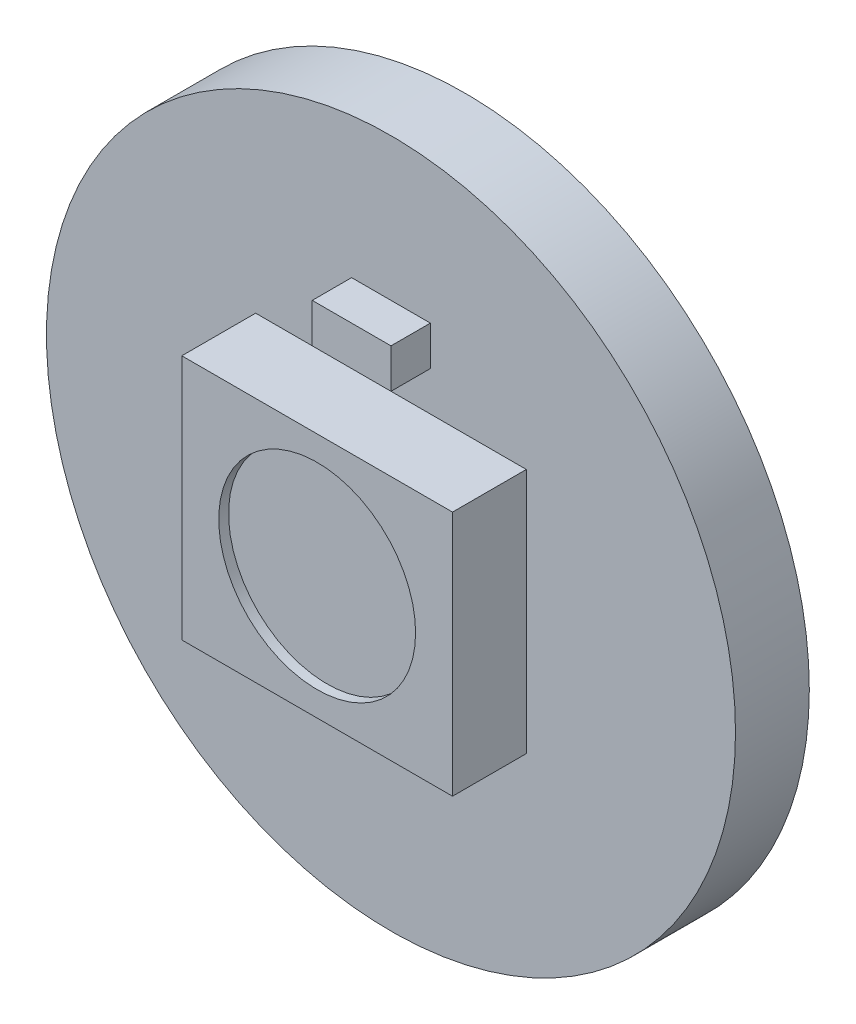
ISO-10303-21;
HEADER;
FILE_DESCRIPTION(('STEP AP214'),'2;1');
FILE_NAME('part.step','',(''),(''),'','','');
FILE_SCHEMA(('AUTOMOTIVE_DESIGN { 1 0 10303 214 1 1 1 1 }'));
ENDSEC;
DATA;
#1=APPLICATION_CONTEXT('core data for automotive mechanical design processes');
#2=APPLICATION_PROTOCOL_DEFINITION('international standard','automotive_design',2000,#1);
#3=PRODUCT_CONTEXT('',#1,'mechanical');
#4=PRODUCT('Part','Part','',(#3));
#5=PRODUCT_RELATED_PRODUCT_CATEGORY('part','',(#4));
#6=PRODUCT_DEFINITION_FORMATION('','',#4);
#7=PRODUCT_DEFINITION_CONTEXT('part definition',#1,'design');
#8=PRODUCT_DEFINITION('design','',#6,#7);
#9=PRODUCT_DEFINITION_SHAPE('','',#8);
#10=(LENGTH_UNIT() NAMED_UNIT(*) SI_UNIT(.MILLI.,.METRE.));
#11=(NAMED_UNIT(*) PLANE_ANGLE_UNIT() SI_UNIT($,.RADIAN.));
#12=(NAMED_UNIT(*) SI_UNIT($,.STERADIAN.) SOLID_ANGLE_UNIT());
#13=UNCERTAINTY_MEASURE_WITH_UNIT(LENGTH_MEASURE(1.E-05),#10,'distance_accuracy_value','');
#14=(GEOMETRIC_REPRESENTATION_CONTEXT(3) GLOBAL_UNCERTAINTY_ASSIGNED_CONTEXT((#13)) GLOBAL_UNIT_ASSIGNED_CONTEXT((#10,
#11,#12)) REPRESENTATION_CONTEXT('',''));
#15=CARTESIAN_POINT('',(0.,0.,0.));
#16=DIRECTION('',(0.,0.,1.));
#17=DIRECTION('',(1.,0.,0.));
#18=AXIS2_PLACEMENT_3D('',#15,#16,#17);
#19=CARTESIAN_POINT('',(0.,0.,1.5));
#20=DIRECTION('',(0.,0.,1.));
#21=DIRECTION('',(1.,0.,0.));
#22=AXIS2_PLACEMENT_3D('',#19,#20,#21);
#23=PLANE('',#22);
#24=DIRECTION('',(0.,1.,0.));
#25=VECTOR('',#24,1.);
#26=CARTESIAN_POINT('',(2.75,2.5,1.5));
#27=LINE('',#26,#25);
#28=CARTESIAN_POINT('',(2.75,-2.5,1.5));
#29=VERTEX_POINT('',#28);
#30=CARTESIAN_POINT('',(2.75,2.5,1.5));
#31=VERTEX_POINT('',#30);
#32=EDGE_CURVE('E55',#29,#31,#27,.T.);
#33=ORIENTED_EDGE('',*,*,#32,.F.);
#34=DIRECTION('',(1.,0.,0.));
#35=VECTOR('',#34,1.);
#36=CARTESIAN_POINT('',(-2.75,-2.5,1.5));
#37=LINE('',#36,#35);
#38=CARTESIAN_POINT('',(-2.75,-2.5,1.5));
#39=VERTEX_POINT('',#38);
#40=EDGE_CURVE('E136',#39,#29,#37,.T.);
#41=ORIENTED_EDGE('',*,*,#40,.F.);
#42=DIRECTION('',(0.,-1.,0.));
#43=VECTOR('',#42,1.);
#44=CARTESIAN_POINT('',(-2.75,2.5,1.5));
#45=LINE('',#44,#43);
#46=CARTESIAN_POINT('',(-2.75,2.5,1.5));
#47=VERTEX_POINT('',#46);
#48=EDGE_CURVE('E147',#47,#39,#45,.T.);
#49=ORIENTED_EDGE('',*,*,#48,.F.);
#50=DIRECTION('',(-1.,0.,0.));
#51=VECTOR('',#50,1.);
#52=CARTESIAN_POINT('',(-2.75,2.5,1.5));
#53=LINE('',#52,#51);
#54=EDGE_CURVE('E144',#31,#47,#53,.T.);
#55=ORIENTED_EDGE('',*,*,#54,.F.);
#56=EDGE_LOOP('',(#33,#41,#49,#55));
#57=FACE_BOUND('',#56,.T.);
#58=CARTESIAN_POINT('',(0.,0.,1.5));
#59=DIRECTION('',(0.,0.,1.));
#60=DIRECTION('',(1.,0.,0.));
#61=AXIS2_PLACEMENT_3D('',#58,#59,#60);
#62=CIRCLE('',#61,7.);
#63=CARTESIAN_POINT('',(7.,0.,1.5));
#64=VERTEX_POINT('',#63);
#65=EDGE_CURVE('E11',#64,#64,#62,.T.);
#66=ORIENTED_EDGE('',*,*,#65,.T.);
#67=EDGE_LOOP('',(#66));
#68=FACE_BOUND('',#67,.T.);
#69=DIRECTION('',(-1.,0.,0.));
#70=VECTOR('',#69,1.);
#71=CARTESIAN_POINT('',(-0.8,4.1,1.5));
#72=LINE('',#71,#70);
#73=CARTESIAN_POINT('',(0.8,4.1,1.5));
#74=VERTEX_POINT('',#73);
#75=CARTESIAN_POINT('',(-0.8,4.1,1.5));
#76=VERTEX_POINT('',#75);
#77=EDGE_CURVE('E311',#74,#76,#72,.T.);
#78=ORIENTED_EDGE('',*,*,#77,.F.);
#79=DIRECTION('',(0.,1.,0.));
#80=VECTOR('',#79,1.);
#81=CARTESIAN_POINT('',(0.8,4.1,1.5));
#82=LINE('',#81,#80);
#83=CARTESIAN_POINT('',(0.8,3.3,1.5));
#84=VERTEX_POINT('',#83);
#85=EDGE_CURVE('E120',#84,#74,#82,.T.);
#86=ORIENTED_EDGE('',*,*,#85,.F.);
#87=DIRECTION('',(1.,0.,0.));
#88=VECTOR('',#87,1.);
#89=CARTESIAN_POINT('',(-0.8,3.3,1.5));
#90=LINE('',#89,#88);
#91=CARTESIAN_POINT('',(-0.8,3.3,1.5));
#92=VERTEX_POINT('',#91);
#93=EDGE_CURVE('E116',#92,#84,#90,.T.);
#94=ORIENTED_EDGE('',*,*,#93,.F.);
#95=DIRECTION('',(0.,-1.,0.));
#96=VECTOR('',#95,1.);
#97=CARTESIAN_POINT('',(-0.8,4.1,1.5));
#98=LINE('',#97,#96);
#99=EDGE_CURVE('E308',#76,#92,#98,.T.);
#100=ORIENTED_EDGE('',*,*,#99,.F.);
#101=EDGE_LOOP('',(#78,#86,#94,#100));
#102=FACE_BOUND('',#101,.T.);
#103=ADVANCED_FACE('F32',(#57,#68,#102),#23,.T.);
#104=CARTESIAN_POINT('',(0.,0.,1.5));
#105=DIRECTION('',(0.,0.,-1.));
#106=DIRECTION('',(-1.,0.,0.));
#107=AXIS2_PLACEMENT_3D('',#104,#105,#106);
#108=CYLINDRICAL_SURFACE('',#107,7.);
#109=ORIENTED_EDGE('',*,*,#65,.F.);
#110=EDGE_LOOP('',(#109));
#111=FACE_BOUND('',#110,.T.);
#112=CARTESIAN_POINT('',(0.,0.,0.));
#113=DIRECTION('',(0.,0.,1.));
#114=DIRECTION('',(1.,0.,0.));
#115=AXIS2_PLACEMENT_3D('',#112,#113,#114);
#116=CIRCLE('',#115,7.);
#117=CARTESIAN_POINT('',(7.,0.,0.));
#118=VERTEX_POINT('',#117);
#119=EDGE_CURVE('E36',#118,#118,#116,.T.);
#120=ORIENTED_EDGE('',*,*,#119,.T.);
#121=EDGE_LOOP('',(#120));
#122=FACE_BOUND('',#121,.T.);
#123=ADVANCED_FACE('F34',(#111,#122),#108,.T.);
#124=CARTESIAN_POINT('',(0.,0.,0.));
#125=DIRECTION('',(0.,0.,1.));
#126=DIRECTION('',(1.,0.,0.));
#127=AXIS2_PLACEMENT_3D('',#124,#125,#126);
#128=PLANE('',#127);
#129=ORIENTED_EDGE('',*,*,#119,.F.);
#130=EDGE_LOOP('',(#129));
#131=FACE_BOUND('',#130,.T.);
#132=ADVANCED_FACE('F167',(#131),#128,.F.);
#133=CARTESIAN_POINT('',(2.75,2.5,3.));
#134=DIRECTION('',(-1.,0.,0.));
#135=DIRECTION('',(0.,-1.,0.));
#136=AXIS2_PLACEMENT_3D('',#133,#134,#135);
#137=PLANE('',#136);
#138=ORIENTED_EDGE('',*,*,#32,.T.);
#139=DIRECTION('',(0.,0.,-1.));
#140=VECTOR('',#139,1.);
#141=CARTESIAN_POINT('',(2.75,2.5,3.));
#142=LINE('',#141,#140);
#143=CARTESIAN_POINT('',(2.75,2.5,3.));
#144=VERTEX_POINT('',#143);
#145=EDGE_CURVE('E159',#144,#31,#142,.T.);
#146=ORIENTED_EDGE('',*,*,#145,.F.);
#147=DIRECTION('',(0.,1.,0.));
#148=VECTOR('',#147,1.);
#149=CARTESIAN_POINT('',(2.75,2.5,3.));
#150=LINE('',#149,#148);
#151=CARTESIAN_POINT('',(2.75,-2.5,3.));
#152=VERTEX_POINT('',#151);
#153=EDGE_CURVE('E132',#152,#144,#150,.T.);
#154=ORIENTED_EDGE('',*,*,#153,.F.);
#155=DIRECTION('',(0.,0.,-1.));
#156=VECTOR('',#155,1.);
#157=CARTESIAN_POINT('',(2.75,-2.5,3.));
#158=LINE('',#157,#156);
#159=EDGE_CURVE('E142',#152,#29,#158,.T.);
#160=ORIENTED_EDGE('',*,*,#159,.T.);
#161=EDGE_LOOP('',(#138,#146,#154,#160));
#162=FACE_BOUND('',#161,.T.);
#163=ADVANCED_FACE('F169',(#162),#137,.F.);
#164=CARTESIAN_POINT('',(-2.75,2.5,3.));
#165=DIRECTION('',(0.,-1.,0.));
#166=DIRECTION('',(0.,0.,-1.));
#167=AXIS2_PLACEMENT_3D('',#164,#165,#166);
#168=PLANE('',#167);
#169=ORIENTED_EDGE('',*,*,#54,.T.);
#170=DIRECTION('',(0.,0.,-1.));
#171=VECTOR('',#170,1.);
#172=CARTESIAN_POINT('',(-2.75,2.5,3.));
#173=LINE('',#172,#171);
#174=CARTESIAN_POINT('',(-2.75,2.5,3.));
#175=VERTEX_POINT('',#174);
#176=EDGE_CURVE('E156',#175,#47,#173,.T.);
#177=ORIENTED_EDGE('',*,*,#176,.F.);
#178=DIRECTION('',(-1.,0.,0.));
#179=VECTOR('',#178,1.);
#180=CARTESIAN_POINT('',(-2.75,2.5,3.));
#181=LINE('',#180,#179);
#182=EDGE_CURVE('E135',#144,#175,#181,.T.);
#183=ORIENTED_EDGE('',*,*,#182,.F.);
#184=ORIENTED_EDGE('',*,*,#145,.T.);
#185=EDGE_LOOP('',(#169,#177,#183,#184));
#186=FACE_BOUND('',#185,.T.);
#187=ADVANCED_FACE('F174',(#186),#168,.F.);
#188=CARTESIAN_POINT('',(-2.75,2.5,3.));
#189=DIRECTION('',(1.,0.,0.));
#190=DIRECTION('',(0.,1.,0.));
#191=AXIS2_PLACEMENT_3D('',#188,#189,#190);
#192=PLANE('',#191);
#193=ORIENTED_EDGE('',*,*,#48,.T.);
#194=DIRECTION('',(0.,0.,-1.));
#195=VECTOR('',#194,1.);
#196=CARTESIAN_POINT('',(-2.75,-2.5,3.));
#197=LINE('',#196,#195);
#198=CARTESIAN_POINT('',(-2.75,-2.5,3.));
#199=VERTEX_POINT('',#198);
#200=EDGE_CURVE('E153',#199,#39,#197,.T.);
#201=ORIENTED_EDGE('',*,*,#200,.F.);
#202=DIRECTION('',(0.,-1.,0.));
#203=VECTOR('',#202,1.);
#204=CARTESIAN_POINT('',(-2.75,2.5,3.));
#205=LINE('',#204,#203);
#206=EDGE_CURVE('E138',#175,#199,#205,.T.);
#207=ORIENTED_EDGE('',*,*,#206,.F.);
#208=ORIENTED_EDGE('',*,*,#176,.T.);
#209=EDGE_LOOP('',(#193,#201,#207,#208));
#210=FACE_BOUND('',#209,.T.);
#211=ADVANCED_FACE('F186',(#210),#192,.F.);
#212=CARTESIAN_POINT('',(-2.75,-2.5,3.));
#213=DIRECTION('',(0.,1.,0.));
#214=DIRECTION('',(0.,0.,1.));
#215=AXIS2_PLACEMENT_3D('',#212,#213,#214);
#216=PLANE('',#215);
#217=ORIENTED_EDGE('',*,*,#40,.T.);
#218=ORIENTED_EDGE('',*,*,#159,.F.);
#219=DIRECTION('',(1.,0.,0.));
#220=VECTOR('',#219,1.);
#221=CARTESIAN_POINT('',(-2.75,-2.5,3.));
#222=LINE('',#221,#220);
#223=EDGE_CURVE('E140',#199,#152,#222,.T.);
#224=ORIENTED_EDGE('',*,*,#223,.F.);
#225=ORIENTED_EDGE('',*,*,#200,.T.);
#226=EDGE_LOOP('',(#217,#218,#224,#225));
#227=FACE_BOUND('',#226,.T.);
#228=ADVANCED_FACE('F189',(#227),#216,.F.);
#229=CARTESIAN_POINT('',(0.,0.,3.));
#230=DIRECTION('',(0.,0.,1.));
#231=DIRECTION('',(1.,0.,0.));
#232=AXIS2_PLACEMENT_3D('',#229,#230,#231);
#233=PLANE('',#232);
#234=CARTESIAN_POINT('',(0.,0.,3.));
#235=DIRECTION('',(0.,0.,1.));
#236=DIRECTION('',(1.,0.,0.));
#237=AXIS2_PLACEMENT_3D('',#234,#235,#236);
#238=CIRCLE('',#237,2.);
#239=CARTESIAN_POINT('',(2.,0.,3.));
#240=VERTEX_POINT('',#239);
#241=EDGE_CURVE('E122',#240,#240,#238,.T.);
#242=ORIENTED_EDGE('',*,*,#241,.F.);
#243=EDGE_LOOP('',(#242));
#244=FACE_BOUND('',#243,.T.);
#245=ORIENTED_EDGE('',*,*,#153,.T.);
#246=ORIENTED_EDGE('',*,*,#182,.T.);
#247=ORIENTED_EDGE('',*,*,#206,.T.);
#248=ORIENTED_EDGE('',*,*,#223,.T.);
#249=EDGE_LOOP('',(#245,#246,#247,#248));
#250=FACE_BOUND('',#249,.T.);
#251=ADVANCED_FACE('F193',(#244,#250),#233,.T.);
#252=CARTESIAN_POINT('',(0.,0.,2.8));
#253=DIRECTION('',(0.,0.,1.));
#254=DIRECTION('',(1.,0.,0.));
#255=AXIS2_PLACEMENT_3D('',#252,#253,#254);
#256=CYLINDRICAL_SURFACE('',#255,2.);
#257=CARTESIAN_POINT('',(0.,0.,2.8));
#258=DIRECTION('',(0.,0.,1.));
#259=DIRECTION('',(1.,0.,0.));
#260=AXIS2_PLACEMENT_3D('',#257,#258,#259);
#261=CIRCLE('',#260,2.);
#262=CARTESIAN_POINT('',(2.,0.,2.8));
#263=VERTEX_POINT('',#262);
#264=EDGE_CURVE('E125',#263,#263,#261,.T.);
#265=ORIENTED_EDGE('',*,*,#264,.F.);
#266=EDGE_LOOP('',(#265));
#267=FACE_BOUND('',#266,.T.);
#268=ORIENTED_EDGE('',*,*,#241,.T.);
#269=EDGE_LOOP('',(#268));
#270=FACE_BOUND('',#269,.T.);
#271=ADVANCED_FACE('F197',(#267,#270),#256,.F.);
#272=CARTESIAN_POINT('',(0.,0.,2.8));
#273=DIRECTION('',(0.,0.,1.));
#274=DIRECTION('',(1.,0.,0.));
#275=AXIS2_PLACEMENT_3D('',#272,#273,#274);
#276=PLANE('',#275);
#277=ORIENTED_EDGE('',*,*,#264,.T.);
#278=EDGE_LOOP('',(#277));
#279=FACE_BOUND('',#278,.T.);
#280=ADVANCED_FACE('F201',(#279),#276,.T.);
#281=CARTESIAN_POINT('',(0.8,4.1,2.3));
#282=DIRECTION('',(-1.,0.,0.));
#283=DIRECTION('',(0.,-1.,0.));
#284=AXIS2_PLACEMENT_3D('',#281,#282,#283);
#285=PLANE('',#284);
#286=ORIENTED_EDGE('',*,*,#85,.T.);
#287=DIRECTION('',(0.,0.,-1.));
#288=VECTOR('',#287,1.);
#289=CARTESIAN_POINT('',(0.8,4.1,2.3));
#290=LINE('',#289,#288);
#291=CARTESIAN_POINT('',(0.8,4.1,2.3));
#292=VERTEX_POINT('',#291);
#293=EDGE_CURVE('E101',#292,#74,#290,.T.);
#294=ORIENTED_EDGE('',*,*,#293,.F.);
#295=DIRECTION('',(0.,1.,0.));
#296=VECTOR('',#295,1.);
#297=CARTESIAN_POINT('',(0.8,4.1,2.3));
#298=LINE('',#297,#296);
#299=CARTESIAN_POINT('',(0.8,3.3,2.3));
#300=VERTEX_POINT('',#299);
#301=EDGE_CURVE('E108',#300,#292,#298,.T.);
#302=ORIENTED_EDGE('',*,*,#301,.F.);
#303=DIRECTION('',(0.,0.,-1.));
#304=VECTOR('',#303,1.);
#305=CARTESIAN_POINT('',(0.8,3.3,2.3));
#306=LINE('',#305,#304);
#307=EDGE_CURVE('E305',#300,#84,#306,.T.);
#308=ORIENTED_EDGE('',*,*,#307,.T.);
#309=EDGE_LOOP('',(#286,#294,#302,#308));
#310=FACE_BOUND('',#309,.T.);
#311=ADVANCED_FACE('F118',(#310),#285,.F.);
#312=CARTESIAN_POINT('',(-0.8,4.1,2.3));
#313=DIRECTION('',(0.,-1.,0.));
#314=DIRECTION('',(0.,0.,-1.));
#315=AXIS2_PLACEMENT_3D('',#312,#313,#314);
#316=PLANE('',#315);
#317=ORIENTED_EDGE('',*,*,#77,.T.);
#318=DIRECTION('',(0.,0.,-1.));
#319=VECTOR('',#318,1.);
#320=CARTESIAN_POINT('',(-0.8,4.1,2.3));
#321=LINE('',#320,#319);
#322=CARTESIAN_POINT('',(-0.8,4.1,2.3));
#323=VERTEX_POINT('',#322);
#324=EDGE_CURVE('E104',#323,#76,#321,.T.);
#325=ORIENTED_EDGE('',*,*,#324,.F.);
#326=DIRECTION('',(-1.,0.,0.));
#327=VECTOR('',#326,1.);
#328=CARTESIAN_POINT('',(-0.8,4.1,2.3));
#329=LINE('',#328,#327);
#330=EDGE_CURVE('E97',#292,#323,#329,.T.);
#331=ORIENTED_EDGE('',*,*,#330,.F.);
#332=ORIENTED_EDGE('',*,*,#293,.T.);
#333=EDGE_LOOP('',(#317,#325,#331,#332));
#334=FACE_BOUND('',#333,.T.);
#335=ADVANCED_FACE('F99',(#334),#316,.F.);
#336=CARTESIAN_POINT('',(-0.8,4.1,2.3));
#337=DIRECTION('',(1.,0.,0.));
#338=DIRECTION('',(0.,1.,0.));
#339=AXIS2_PLACEMENT_3D('',#336,#337,#338);
#340=PLANE('',#339);
#341=ORIENTED_EDGE('',*,*,#99,.T.);
#342=DIRECTION('',(0.,0.,-1.));
#343=VECTOR('',#342,1.);
#344=CARTESIAN_POINT('',(-0.8,3.3,2.3));
#345=LINE('',#344,#343);
#346=CARTESIAN_POINT('',(-0.8,3.3,2.3));
#347=VERTEX_POINT('',#346);
#348=EDGE_CURVE('E47',#347,#92,#345,.T.);
#349=ORIENTED_EDGE('',*,*,#348,.F.);
#350=DIRECTION('',(0.,-1.,0.));
#351=VECTOR('',#350,1.);
#352=CARTESIAN_POINT('',(-0.8,4.1,2.3));
#353=LINE('',#352,#351);
#354=EDGE_CURVE('E107',#323,#347,#353,.T.);
#355=ORIENTED_EDGE('',*,*,#354,.F.);
#356=ORIENTED_EDGE('',*,*,#324,.T.);
#357=EDGE_LOOP('',(#341,#349,#355,#356));
#358=FACE_BOUND('',#357,.T.);
#359=ADVANCED_FACE('F210',(#358),#340,.F.);
#360=CARTESIAN_POINT('',(-0.8,3.3,2.3));
#361=DIRECTION('',(0.,1.,0.));
#362=DIRECTION('',(0.,0.,1.));
#363=AXIS2_PLACEMENT_3D('',#360,#361,#362);
#364=PLANE('',#363);
#365=ORIENTED_EDGE('',*,*,#93,.T.);
#366=ORIENTED_EDGE('',*,*,#307,.F.);
#367=DIRECTION('',(1.,0.,0.));
#368=VECTOR('',#367,1.);
#369=CARTESIAN_POINT('',(-0.8,3.3,2.3));
#370=LINE('',#369,#368);
#371=EDGE_CURVE('E112',#347,#300,#370,.T.);
#372=ORIENTED_EDGE('',*,*,#371,.F.);
#373=ORIENTED_EDGE('',*,*,#348,.T.);
#374=EDGE_LOOP('',(#365,#366,#372,#373));
#375=FACE_BOUND('',#374,.T.);
#376=ADVANCED_FACE('F213',(#375),#364,.F.);
#377=CARTESIAN_POINT('',(0.,0.,2.3));
#378=DIRECTION('',(0.,0.,1.));
#379=DIRECTION('',(1.,0.,0.));
#380=AXIS2_PLACEMENT_3D('',#377,#378,#379);
#381=PLANE('',#380);
#382=ORIENTED_EDGE('',*,*,#301,.T.);
#383=ORIENTED_EDGE('',*,*,#330,.T.);
#384=ORIENTED_EDGE('',*,*,#354,.T.);
#385=ORIENTED_EDGE('',*,*,#371,.T.);
#386=EDGE_LOOP('',(#382,#383,#384,#385));
#387=FACE_BOUND('',#386,.T.);
#388=ADVANCED_FACE('F111',(#387),#381,.T.);
#389=CLOSED_SHELL('',(#103,#123,#132,#163,#187,#211,#228,#251,#271,#280,#311,#335,#359,#376,#388));
#390=MANIFOLD_SOLID_BREP('B2',#389);
#391=ADVANCED_BREP_SHAPE_REPRESENTATION('',(#18,#390),#14);
#392=SHAPE_DEFINITION_REPRESENTATION(#9,#391);
ENDSEC;
END-ISO-10303-21;
